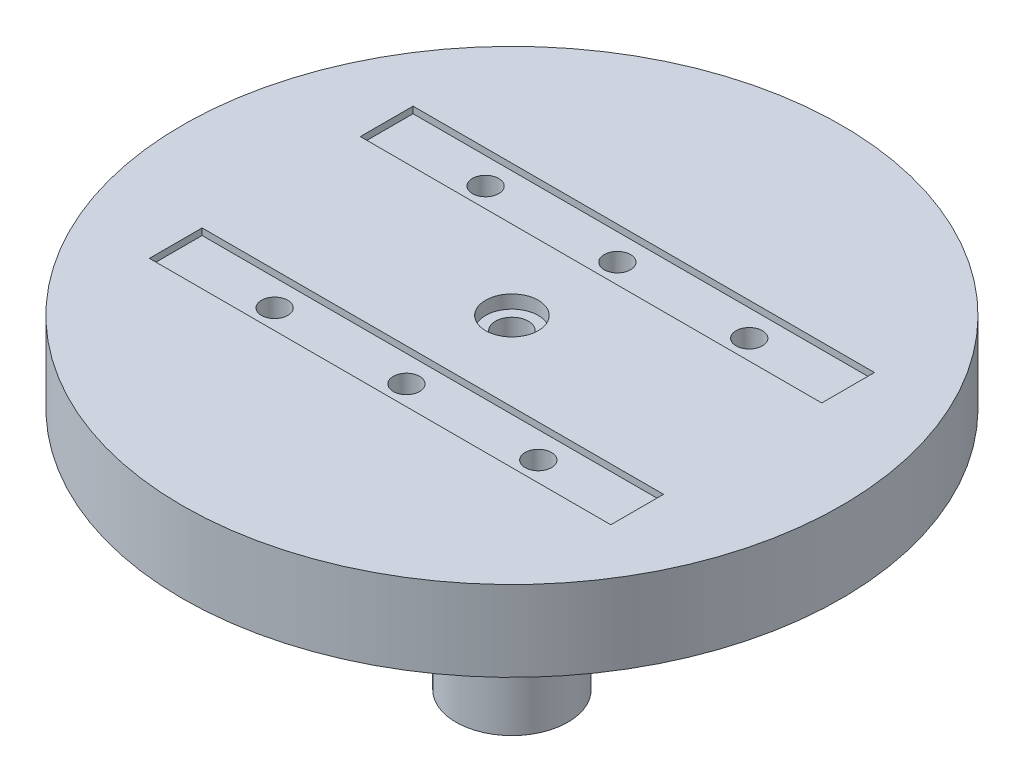
ISO-10303-21;
HEADER;
FILE_DESCRIPTION(('STEP AP214'),'2;1');
FILE_NAME('part.step','',(''),(''),'','','');
FILE_SCHEMA(('AUTOMOTIVE_DESIGN { 1 0 10303 214 1 1 1 1 }'));
ENDSEC;
DATA;
#1=APPLICATION_CONTEXT('core data for automotive mechanical design processes');
#2=APPLICATION_PROTOCOL_DEFINITION('international standard','automotive_design',2000,#1);
#3=PRODUCT_CONTEXT('',#1,'mechanical');
#4=PRODUCT('Part','Part','',(#3));
#5=PRODUCT_RELATED_PRODUCT_CATEGORY('part','',(#4));
#6=PRODUCT_DEFINITION_FORMATION('','',#4);
#7=PRODUCT_DEFINITION_CONTEXT('part definition',#1,'design');
#8=PRODUCT_DEFINITION('design','',#6,#7);
#9=PRODUCT_DEFINITION_SHAPE('','',#8);
#10=(LENGTH_UNIT() NAMED_UNIT(*) SI_UNIT(.MILLI.,.METRE.));
#11=(NAMED_UNIT(*) PLANE_ANGLE_UNIT() SI_UNIT($,.RADIAN.));
#12=(NAMED_UNIT(*) SI_UNIT($,.STERADIAN.) SOLID_ANGLE_UNIT());
#13=UNCERTAINTY_MEASURE_WITH_UNIT(LENGTH_MEASURE(1.E-05),#10,'distance_accuracy_value','');
#14=(GEOMETRIC_REPRESENTATION_CONTEXT(3) GLOBAL_UNCERTAINTY_ASSIGNED_CONTEXT((#13)) GLOBAL_UNIT_ASSIGNED_CONTEXT((#10,
#11,#12)) REPRESENTATION_CONTEXT('',''));
#15=CARTESIAN_POINT('',(0.,0.,0.));
#16=DIRECTION('',(0.,0.,1.));
#17=DIRECTION('',(1.,0.,0.));
#18=AXIS2_PLACEMENT_3D('',#15,#16,#17);
#19=CARTESIAN_POINT('',(0.,-16.,0.));
#20=DIRECTION('',(0.,1.,0.));
#21=DIRECTION('',(0.,0.,1.));
#22=AXIS2_PLACEMENT_3D('',#19,#20,#21);
#23=CYLINDRICAL_SURFACE('',#22,20.);
#24=CARTESIAN_POINT('',(0.,-6.,0.));
#25=DIRECTION('',(0.,-1.,0.));
#26=DIRECTION('',(0.,0.,-1.));
#27=AXIS2_PLACEMENT_3D('',#24,#25,#26);
#28=CIRCLE('',#27,20.);
#29=CARTESIAN_POINT('',(0.,-6.,-20.));
#30=VERTEX_POINT('',#29);
#31=EDGE_CURVE('E59',#30,#30,#28,.T.);
#32=ORIENTED_EDGE('',*,*,#31,.T.);
#33=EDGE_LOOP('',(#32));
#34=FACE_BOUND('',#33,.T.);
#35=CARTESIAN_POINT('',(0.,-14.,0.));
#36=DIRECTION('',(0.,-1.,0.));
#37=DIRECTION('',(0.,0.,-1.));
#38=AXIS2_PLACEMENT_3D('',#35,#36,#37);
#39=CIRCLE('',#38,20.);
#40=CARTESIAN_POINT('',(0.,-14.,-20.));
#41=VERTEX_POINT('',#40);
#42=EDGE_CURVE('E63',#41,#41,#39,.F.);
#43=ORIENTED_EDGE('',*,*,#42,.T.);
#44=EDGE_LOOP('',(#43));
#45=FACE_BOUND('',#44,.T.);
#46=ADVANCED_FACE('F48',(#34,#45),#23,.T.);
#47=CARTESIAN_POINT('',(0.,-16.,0.));
#48=DIRECTION('',(0.,-1.,0.));
#49=DIRECTION('',(0.,0.,-1.));
#50=AXIS2_PLACEMENT_3D('',#47,#48,#49);
#51=PLANE('',#50);
#52=CARTESIAN_POINT('',(0.,-16.,0.));
#53=DIRECTION('',(0.,-1.,0.));
#54=DIRECTION('',(0.,0.,-1.));
#55=AXIS2_PLACEMENT_3D('',#52,#53,#54);
#56=CIRCLE('',#55,18.);
#57=CARTESIAN_POINT('',(0.,-16.,-18.));
#58=VERTEX_POINT('',#57);
#59=EDGE_CURVE('E11',#58,#58,#56,.T.);
#60=ORIENTED_EDGE('',*,*,#59,.T.);
#61=EDGE_LOOP('',(#60));
#62=FACE_BOUND('',#61,.T.);
#63=ADVANCED_FACE('F79',(#62),#51,.T.);
#64=CARTESIAN_POINT('',(0.,-4.,0.));
#65=DIRECTION('',(0.,-1.,0.));
#66=DIRECTION('',(0.,0.,-1.));
#67=AXIS2_PLACEMENT_3D('',#64,#65,#66);
#68=PLANE('',#67);
#69=CARTESIAN_POINT('',(0.,-4.,0.));
#70=DIRECTION('',(0.,-1.,0.));
#71=DIRECTION('',(0.,0.,-1.));
#72=AXIS2_PLACEMENT_3D('',#69,#70,#71);
#73=CIRCLE('',#72,18.);
#74=CARTESIAN_POINT('',(0.,-4.,-18.));
#75=VERTEX_POINT('',#74);
#76=EDGE_CURVE('E55',#75,#75,#73,.F.);
#77=ORIENTED_EDGE('',*,*,#76,.T.);
#78=EDGE_LOOP('',(#77));
#79=FACE_BOUND('',#78,.T.);
#80=ADVANCED_FACE('F76',(#79),#68,.F.);
#81=CARTESIAN_POINT('',(0.,-6.,0.));
#82=DIRECTION('',(0.,-1.,0.));
#83=DIRECTION('',(0.,0.,-1.));
#84=AXIS2_PLACEMENT_3D('',#81,#82,#83);
#85=TOROIDAL_SURFACE('',#84,18.,2.);
#86=ORIENTED_EDGE('',*,*,#76,.F.);
#87=EDGE_LOOP('',(#86));
#88=FACE_BOUND('',#87,.T.);
#89=ORIENTED_EDGE('',*,*,#31,.F.);
#90=EDGE_LOOP('',(#89));
#91=FACE_BOUND('',#90,.T.);
#92=ADVANCED_FACE('F72',(#88,#91),#85,.T.);
#93=CARTESIAN_POINT('',(0.,-14.,0.));
#94=DIRECTION('',(0.,-1.,0.));
#95=DIRECTION('',(0.,0.,-1.));
#96=AXIS2_PLACEMENT_3D('',#93,#94,#95);
#97=TOROIDAL_SURFACE('',#96,18.,2.);
#98=ORIENTED_EDGE('',*,*,#42,.F.);
#99=EDGE_LOOP('',(#98));
#100=FACE_BOUND('',#99,.T.);
#101=ORIENTED_EDGE('',*,*,#59,.F.);
#102=EDGE_LOOP('',(#101));
#103=FACE_BOUND('',#102,.T.);
#104=ADVANCED_FACE('F50',(#100,#103),#97,.T.);
#105=CLOSED_SHELL('',(#46,#63,#80,#92,#104));
#106=MANIFOLD_SOLID_BREP('B2',#105);
#107=CARTESIAN_POINT('',(0.,-4.,0.));
#108=DIRECTION('',(0.,1.,0.));
#109=DIRECTION('',(0.,0.,1.));
#110=AXIS2_PLACEMENT_3D('',#107,#108,#109);
#111=CYLINDRICAL_SURFACE('',#110,10.);
#112=CARTESIAN_POINT('',(0.,-4.,0.));
#113=DIRECTION('',(0.,-1.,0.));
#114=DIRECTION('',(0.,0.,-1.));
#115=AXIS2_PLACEMENT_3D('',#112,#113,#114);
#116=CIRCLE('',#115,10.);
#117=CARTESIAN_POINT('',(0.,-4.,-10.));
#118=VERTEX_POINT('',#117);
#119=EDGE_CURVE('E47',#118,#118,#116,.T.);
#120=ORIENTED_EDGE('',*,*,#119,.F.);
#121=EDGE_LOOP('',(#120));
#122=FACE_BOUND('',#121,.T.);
#123=CARTESIAN_POINT('',(0.,-2.,0.));
#124=DIRECTION('',(0.,-1.,0.));
#125=DIRECTION('',(0.,0.,-1.));
#126=AXIS2_PLACEMENT_3D('',#123,#124,#125);
#127=CIRCLE('',#126,10.);
#128=CARTESIAN_POINT('',(0.,-2.,-10.));
#129=VERTEX_POINT('',#128);
#130=EDGE_CURVE('E130',#129,#129,#127,.T.);
#131=ORIENTED_EDGE('',*,*,#130,.T.);
#132=EDGE_LOOP('',(#131));
#133=FACE_BOUND('',#132,.T.);
#134=ADVANCED_FACE('F127',(#122,#133),#111,.T.);
#135=CARTESIAN_POINT('',(0.,-4.,0.));
#136=DIRECTION('',(0.,-1.,0.));
#137=DIRECTION('',(0.,0.,-1.));
#138=AXIS2_PLACEMENT_3D('',#135,#136,#137);
#139=PLANE('',#138);
#140=ORIENTED_EDGE('',*,*,#119,.T.);
#141=EDGE_LOOP('',(#140));
#142=FACE_BOUND('',#141,.T.);
#143=ADVANCED_FACE('F142',(#142),#139,.T.);
#144=CARTESIAN_POINT('',(0.,-2.,0.));
#145=DIRECTION('',(0.,-1.,0.));
#146=DIRECTION('',(0.,0.,-1.));
#147=AXIS2_PLACEMENT_3D('',#144,#145,#146);
#148=PLANE('',#147);
#149=ORIENTED_EDGE('',*,*,#130,.F.);
#150=EDGE_LOOP('',(#149));
#151=FACE_BOUND('',#150,.T.);
#152=ADVANCED_FACE('F140',(#151),#148,.F.);
#153=CLOSED_SHELL('',(#134,#143,#152));
#154=MANIFOLD_SOLID_BREP('B6',#153);
#155=CARTESIAN_POINT('',(0.,-2.,0.));
#156=DIRECTION('',(0.,1.,0.));
#157=DIRECTION('',(0.,0.,1.));
#158=AXIS2_PLACEMENT_3D('',#155,#156,#157);
#159=CYLINDRICAL_SURFACE('',#158,10.);
#160=CARTESIAN_POINT('',(0.,-2.,0.));
#161=DIRECTION('',(0.,-1.,0.));
#162=DIRECTION('',(0.,0.,-1.));
#163=AXIS2_PLACEMENT_3D('',#160,#161,#162);
#164=CIRCLE('',#163,10.);
#165=CARTESIAN_POINT('',(0.,-2.,-10.));
#166=VERTEX_POINT('',#165);
#167=EDGE_CURVE('E126',#166,#166,#164,.T.);
#168=ORIENTED_EDGE('',*,*,#167,.F.);
#169=EDGE_LOOP('',(#168));
#170=FACE_BOUND('',#169,.T.);
#171=CARTESIAN_POINT('',(0.,0.,0.));
#172=DIRECTION('',(0.,-1.,0.));
#173=DIRECTION('',(0.,0.,-1.));
#174=AXIS2_PLACEMENT_3D('',#171,#172,#173);
#175=CIRCLE('',#174,10.);
#176=CARTESIAN_POINT('',(0.,0.,-10.));
#177=VERTEX_POINT('',#176);
#178=EDGE_CURVE('E179',#177,#177,#175,.T.);
#179=ORIENTED_EDGE('',*,*,#178,.T.);
#180=EDGE_LOOP('',(#179));
#181=FACE_BOUND('',#180,.T.);
#182=ADVANCED_FACE('F176',(#170,#181),#159,.T.);
#183=CARTESIAN_POINT('',(0.,-2.,0.));
#184=DIRECTION('',(0.,-1.,0.));
#185=DIRECTION('',(0.,0.,-1.));
#186=AXIS2_PLACEMENT_3D('',#183,#184,#185);
#187=PLANE('',#186);
#188=ORIENTED_EDGE('',*,*,#167,.T.);
#189=EDGE_LOOP('',(#188));
#190=FACE_BOUND('',#189,.T.);
#191=ADVANCED_FACE('F191',(#190),#187,.T.);
#192=CARTESIAN_POINT('',(0.,0.,0.));
#193=DIRECTION('',(0.,-1.,0.));
#194=DIRECTION('',(0.,0.,-1.));
#195=AXIS2_PLACEMENT_3D('',#192,#193,#194);
#196=PLANE('',#195);
#197=ORIENTED_EDGE('',*,*,#178,.F.);
#198=EDGE_LOOP('',(#197));
#199=FACE_BOUND('',#198,.T.);
#200=ADVANCED_FACE('F189',(#199),#196,.F.);
#201=CLOSED_SHELL('',(#182,#191,#200));
#202=MANIFOLD_SOLID_BREP('B42',#201);
#203=CARTESIAN_POINT('',(0.,-37.,0.));
#204=DIRECTION('',(0.,1.,0.));
#205=DIRECTION('',(0.,0.,1.));
#206=AXIS2_PLACEMENT_3D('',#203,#204,#205);
#207=CYLINDRICAL_SURFACE('',#206,8.5);
#208=CARTESIAN_POINT('',(0.,-37.,0.));
#209=DIRECTION('',(0.,-1.,0.));
#210=DIRECTION('',(0.,0.,-1.));
#211=AXIS2_PLACEMENT_3D('',#208,#209,#210);
#212=CIRCLE('',#211,8.5);
#213=CARTESIAN_POINT('',(0.,-37.,-8.5));
#214=VERTEX_POINT('',#213);
#215=EDGE_CURVE('E232',#214,#214,#212,.T.);
#216=ORIENTED_EDGE('',*,*,#215,.F.);
#217=EDGE_LOOP('',(#216));
#218=FACE_BOUND('',#217,.T.);
#219=CARTESIAN_POINT('',(0.,3.,0.));
#220=DIRECTION('',(0.,-1.,0.));
#221=DIRECTION('',(0.,0.,-1.));
#222=AXIS2_PLACEMENT_3D('',#219,#220,#221);
#223=CIRCLE('',#222,8.5);
#224=CARTESIAN_POINT('',(0.,3.,-8.5));
#225=VERTEX_POINT('',#224);
#226=EDGE_CURVE('E236',#225,#225,#223,.T.);
#227=ORIENTED_EDGE('',*,*,#226,.T.);
#228=EDGE_LOOP('',(#227));
#229=FACE_BOUND('',#228,.T.);
#230=ADVANCED_FACE('F226',(#218,#229),#207,.T.);
#231=CARTESIAN_POINT('',(0.,-37.,0.));
#232=DIRECTION('',(0.,-1.,0.));
#233=DIRECTION('',(0.,0.,-1.));
#234=AXIS2_PLACEMENT_3D('',#231,#232,#233);
#235=PLANE('',#234);
#236=CARTESIAN_POINT('',(0.,-37.,0.));
#237=DIRECTION('',(0.,-1.,0.));
#238=DIRECTION('',(0.,0.,-1.));
#239=AXIS2_PLACEMENT_3D('',#236,#237,#238);
#240=CIRCLE('',#239,2.5);
#241=CARTESIAN_POINT('',(0.,-37.,-2.5));
#242=VERTEX_POINT('',#241);
#243=EDGE_CURVE('E243',#242,#242,#240,.T.);
#244=ORIENTED_EDGE('',*,*,#243,.F.);
#245=EDGE_LOOP('',(#244));
#246=FACE_BOUND('',#245,.T.);
#247=ORIENTED_EDGE('',*,*,#215,.T.);
#248=EDGE_LOOP('',(#247));
#249=FACE_BOUND('',#248,.T.);
#250=ADVANCED_FACE('F266',(#246,#249),#235,.T.);
#251=CARTESIAN_POINT('',(0.,3.,0.));
#252=DIRECTION('',(0.,-1.,0.));
#253=DIRECTION('',(0.,0.,-1.));
#254=AXIS2_PLACEMENT_3D('',#251,#252,#253);
#255=PLANE('',#254);
#256=ORIENTED_EDGE('',*,*,#226,.F.);
#257=EDGE_LOOP('',(#256));
#258=FACE_BOUND('',#257,.T.);
#259=ADVANCED_FACE('F257',(#258),#255,.F.);
#260=CARTESIAN_POINT('',(0.,-41.,0.));
#261=DIRECTION('',(0.,-1.,0.));
#262=DIRECTION('',(0.,0.,-1.));
#263=AXIS2_PLACEMENT_3D('',#260,#261,#262);
#264=PLANE('',#263);
#265=CARTESIAN_POINT('',(0.,-41.,0.));
#266=DIRECTION('',(0.,-1.,0.));
#267=DIRECTION('',(0.,0.,-1.));
#268=AXIS2_PLACEMENT_3D('',#265,#266,#267);
#269=CIRCLE('',#268,2.5);
#270=CARTESIAN_POINT('',(0.,-41.,-2.5));
#271=VERTEX_POINT('',#270);
#272=EDGE_CURVE('E241',#271,#271,#269,.T.);
#273=ORIENTED_EDGE('',*,*,#272,.T.);
#274=EDGE_LOOP('',(#273));
#275=FACE_BOUND('',#274,.T.);
#276=CARTESIAN_POINT('',(0.,-41.,0.));
#277=DIRECTION('',(0.,-1.,0.));
#278=DIRECTION('',(0.,0.,-1.));
#279=AXIS2_PLACEMENT_3D('',#276,#277,#278);
#280=CIRCLE('',#279,2.25);
#281=CARTESIAN_POINT('',(0.,-41.,-2.25));
#282=VERTEX_POINT('',#281);
#283=EDGE_CURVE('E246',#282,#282,#280,.T.);
#284=ORIENTED_EDGE('',*,*,#283,.F.);
#285=EDGE_LOOP('',(#284));
#286=FACE_BOUND('',#285,.T.);
#287=ADVANCED_FACE('F254',(#275,#286),#264,.T.);
#288=CARTESIAN_POINT('',(0.,-41.,0.));
#289=DIRECTION('',(0.,1.,0.));
#290=DIRECTION('',(0.,0.,1.));
#291=AXIS2_PLACEMENT_3D('',#288,#289,#290);
#292=CYLINDRICAL_SURFACE('',#291,2.5);
#293=ORIENTED_EDGE('',*,*,#272,.F.);
#294=EDGE_LOOP('',(#293));
#295=FACE_BOUND('',#294,.T.);
#296=ORIENTED_EDGE('',*,*,#243,.T.);
#297=EDGE_LOOP('',(#296));
#298=FACE_BOUND('',#297,.T.);
#299=ADVANCED_FACE('F256',(#295,#298),#292,.T.);
#300=CARTESIAN_POINT('',(0.,-41.,0.));
#301=DIRECTION('',(0.,1.,0.));
#302=DIRECTION('',(0.,0.,1.));
#303=AXIS2_PLACEMENT_3D('',#300,#301,#302);
#304=CYLINDRICAL_SURFACE('',#303,2.25);
#305=ORIENTED_EDGE('',*,*,#283,.T.);
#306=EDGE_LOOP('',(#305));
#307=FACE_BOUND('',#306,.T.);
#308=CARTESIAN_POINT('',(0.,-37.,0.));
#309=DIRECTION('',(0.,-1.,0.));
#310=DIRECTION('',(0.,0.,-1.));
#311=AXIS2_PLACEMENT_3D('',#308,#309,#310);
#312=CIRCLE('',#311,2.25);
#313=CARTESIAN_POINT('',(0.,-37.,-2.25));
#314=VERTEX_POINT('',#313);
#315=EDGE_CURVE('E175',#314,#314,#312,.F.);
#316=ORIENTED_EDGE('',*,*,#315,.T.);
#317=EDGE_LOOP('',(#316));
#318=FACE_BOUND('',#317,.T.);
#319=ADVANCED_FACE('F252',(#307,#318),#304,.F.);
#320=ORIENTED_EDGE('',*,*,#315,.F.);
#321=EDGE_LOOP('',(#320));
#322=FACE_BOUND('',#321,.T.);
#323=ADVANCED_FACE('F276',(#322),#235,.T.);
#324=CLOSED_SHELL('',(#230,#250,#259,#287,#299,#319,#323));
#325=MANIFOLD_SOLID_BREP('B121',#324);
#326=CARTESIAN_POINT('',(0.,0.,0.));
#327=DIRECTION('',(0.,1.,0.));
#328=DIRECTION('',(0.,0.,1.));
#329=AXIS2_PLACEMENT_3D('',#326,#327,#328);
#330=PLANE('',#329);
#331=CARTESIAN_POINT('',(0.,0.,0.));
#332=DIRECTION('',(0.,-1.,0.));
#333=DIRECTION('',(0.,0.,-1.));
#334=AXIS2_PLACEMENT_3D('',#331,#332,#333);
#335=CIRCLE('',#334,8.5);
#336=CARTESIAN_POINT('',(0.,0.,-8.5));
#337=VERTEX_POINT('',#336);
#338=EDGE_CURVE('E548',#337,#337,#335,.T.);
#339=ORIENTED_EDGE('',*,*,#338,.F.);
#340=EDGE_LOOP('',(#339));
#341=FACE_BOUND('',#340,.T.);
#342=CARTESIAN_POINT('',(-20.,0.,16.));
#343=DIRECTION('',(0.,1.,0.));
#344=DIRECTION('',(0.,0.,1.));
#345=AXIS2_PLACEMENT_3D('',#342,#343,#344);
#346=CIRCLE('',#345,2.);
#347=CARTESIAN_POINT('',(-20.,0.,18.));
#348=VERTEX_POINT('',#347);
#349=EDGE_CURVE('E530',#348,#348,#346,.T.);
#350=ORIENTED_EDGE('',*,*,#349,.T.);
#351=EDGE_LOOP('',(#350));
#352=FACE_BOUND('',#351,.T.);
#353=CARTESIAN_POINT('',(-20.,0.,-16.));
#354=DIRECTION('',(0.,-1.,0.));
#355=DIRECTION('',(0.,0.,-1.));
#356=AXIS2_PLACEMENT_3D('',#353,#354,#355);
#357=CIRCLE('',#356,2.);
#358=CARTESIAN_POINT('',(-20.,0.,-18.));
#359=VERTEX_POINT('',#358);
#360=EDGE_CURVE('E527',#359,#359,#357,.T.);
#361=ORIENTED_EDGE('',*,*,#360,.F.);
#362=EDGE_LOOP('',(#361));
#363=FACE_BOUND('',#362,.T.);
#364=CARTESIAN_POINT('',(20.,0.,-16.));
#365=DIRECTION('',(0.,-1.,0.));
#366=DIRECTION('',(0.,0.,-1.));
#367=AXIS2_PLACEMENT_3D('',#364,#365,#366);
#368=CIRCLE('',#367,2.);
#369=CARTESIAN_POINT('',(20.,0.,-18.));
#370=VERTEX_POINT('',#369);
#371=EDGE_CURVE('E531',#370,#370,#368,.T.);
#372=ORIENTED_EDGE('',*,*,#371,.F.);
#373=EDGE_LOOP('',(#372));
#374=FACE_BOUND('',#373,.T.);
#375=CARTESIAN_POINT('',(0.,0.,0.));
#376=DIRECTION('',(0.,1.,0.));
#377=DIRECTION('',(0.,0.,1.));
#378=AXIS2_PLACEMENT_3D('',#375,#376,#377);
#379=CIRCLE('',#378,50.);
#380=CARTESIAN_POINT('',(0.,0.,50.));
#381=VERTEX_POINT('',#380);
#382=EDGE_CURVE('E336',#381,#381,#379,.T.);
#383=ORIENTED_EDGE('',*,*,#382,.F.);
#384=EDGE_LOOP('',(#383));
#385=FACE_BOUND('',#384,.T.);
#386=CARTESIAN_POINT('',(0.,0.,-16.));
#387=DIRECTION('',(0.,1.,0.));
#388=DIRECTION('',(0.,0.,1.));
#389=AXIS2_PLACEMENT_3D('',#386,#387,#388);
#390=CIRCLE('',#389,2.);
#391=CARTESIAN_POINT('',(0.,0.,-14.));
#392=VERTEX_POINT('',#391);
#393=EDGE_CURVE('E424',#392,#392,#390,.F.);
#394=ORIENTED_EDGE('',*,*,#393,.F.);
#395=EDGE_LOOP('',(#394));
#396=FACE_BOUND('',#395,.T.);
#397=CARTESIAN_POINT('',(20.,0.,16.));
#398=DIRECTION('',(0.,1.,0.));
#399=DIRECTION('',(0.,0.,1.));
#400=AXIS2_PLACEMENT_3D('',#397,#398,#399);
#401=CIRCLE('',#400,2.);
#402=CARTESIAN_POINT('',(20.,0.,18.));
#403=VERTEX_POINT('',#402);
#404=EDGE_CURVE('E539',#403,#403,#401,.T.);
#405=ORIENTED_EDGE('',*,*,#404,.T.);
#406=EDGE_LOOP('',(#405));
#407=FACE_BOUND('',#406,.T.);
#408=CARTESIAN_POINT('',(0.,0.,16.));
#409=DIRECTION('',(0.,1.,0.));
#410=DIRECTION('',(0.,0.,1.));
#411=AXIS2_PLACEMENT_3D('',#408,#409,#410);
#412=CIRCLE('',#411,2.);
#413=CARTESIAN_POINT('',(0.,0.,18.));
#414=VERTEX_POINT('',#413);
#415=EDGE_CURVE('E536',#414,#414,#412,.T.);
#416=ORIENTED_EDGE('',*,*,#415,.T.);
#417=EDGE_LOOP('',(#416));
#418=FACE_BOUND('',#417,.T.);
#419=ADVANCED_FACE('F326',(#341,#352,#363,#374,#385,#396,#407,#418),#330,.F.);
#420=CARTESIAN_POINT('',(0.,12.2,0.));
#421=DIRECTION('',(0.,-1.,0.));
#422=DIRECTION('',(0.,0.,-1.));
#423=AXIS2_PLACEMENT_3D('',#420,#421,#422);
#424=CYLINDRICAL_SURFACE('',#423,50.);
#425=CARTESIAN_POINT('',(0.,12.2,0.));
#426=DIRECTION('',(0.,1.,0.));
#427=DIRECTION('',(0.,0.,1.));
#428=AXIS2_PLACEMENT_3D('',#425,#426,#427);
#429=CIRCLE('',#428,50.);
#430=CARTESIAN_POINT('',(0.,12.2,50.));
#431=VERTEX_POINT('',#430);
#432=EDGE_CURVE('E224',#431,#431,#429,.T.);
#433=ORIENTED_EDGE('',*,*,#432,.F.);
#434=EDGE_LOOP('',(#433));
#435=FACE_BOUND('',#434,.T.);
#436=ORIENTED_EDGE('',*,*,#382,.T.);
#437=EDGE_LOOP('',(#436));
#438=FACE_BOUND('',#437,.T.);
#439=ADVANCED_FACE('F328',(#435,#438),#424,.T.);
#440=CARTESIAN_POINT('',(0.,12.2,0.));
#441=DIRECTION('',(0.,1.,0.));
#442=DIRECTION('',(0.,0.,1.));
#443=AXIS2_PLACEMENT_3D('',#440,#441,#442);
#444=PLANE('',#443);
#445=CARTESIAN_POINT('',(0.,12.2,0.));
#446=DIRECTION('',(0.,1.,0.));
#447=DIRECTION('',(0.,0.,1.));
#448=AXIS2_PLACEMENT_3D('',#445,#446,#447);
#449=CIRCLE('',#448,4.);
#450=CARTESIAN_POINT('',(0.,12.2,4.));
#451=VERTEX_POINT('',#450);
#452=EDGE_CURVE('E556',#451,#451,#449,.T.);
#453=ORIENTED_EDGE('',*,*,#452,.F.);
#454=EDGE_LOOP('',(#453));
#455=FACE_BOUND('',#454,.T.);
#456=DIRECTION('',(0.,0.,-1.));
#457=VECTOR('',#456,1.);
#458=CARTESIAN_POINT('',(35.,12.2,12.));
#459=LINE('',#458,#457);
#460=CARTESIAN_POINT('',(35.,12.2,20.));
#461=VERTEX_POINT('',#460);
#462=CARTESIAN_POINT('',(35.,12.2,12.));
#463=VERTEX_POINT('',#462);
#464=EDGE_CURVE('E344',#461,#463,#459,.T.);
#465=ORIENTED_EDGE('',*,*,#464,.F.);
#466=DIRECTION('',(1.,0.,0.));
#467=VECTOR('',#466,1.);
#468=CARTESIAN_POINT('',(-35.,12.2,20.));
#469=LINE('',#468,#467);
#470=CARTESIAN_POINT('',(-35.,12.2,20.));
#471=VERTEX_POINT('',#470);
#472=EDGE_CURVE('E417',#471,#461,#469,.T.);
#473=ORIENTED_EDGE('',*,*,#472,.F.);
#474=DIRECTION('',(0.,0.,1.));
#475=VECTOR('',#474,1.);
#476=CARTESIAN_POINT('',(-35.,12.2,12.));
#477=LINE('',#476,#475);
#478=CARTESIAN_POINT('',(-35.,12.2,12.));
#479=VERTEX_POINT('',#478);
#480=EDGE_CURVE('E421',#479,#471,#477,.T.);
#481=ORIENTED_EDGE('',*,*,#480,.F.);
#482=DIRECTION('',(-1.,0.,0.));
#483=VECTOR('',#482,1.);
#484=CARTESIAN_POINT('',(-35.,12.2,12.));
#485=LINE('',#484,#483);
#486=EDGE_CURVE('E433',#463,#479,#485,.T.);
#487=ORIENTED_EDGE('',*,*,#486,.F.);
#488=EDGE_LOOP('',(#465,#473,#481,#487));
#489=FACE_BOUND('',#488,.T.);
#490=DIRECTION('',(0.,0.,-1.));
#491=VECTOR('',#490,1.);
#492=CARTESIAN_POINT('',(35.,12.2,-20.));
#493=LINE('',#492,#491);
#494=CARTESIAN_POINT('',(35.,12.2,-12.));
#495=VERTEX_POINT('',#494);
#496=CARTESIAN_POINT('',(35.,12.2,-20.));
#497=VERTEX_POINT('',#496);
#498=EDGE_CURVE('E352',#495,#497,#493,.T.);
#499=ORIENTED_EDGE('',*,*,#498,.F.);
#500=DIRECTION('',(1.,0.,0.));
#501=VECTOR('',#500,1.);
#502=CARTESIAN_POINT('',(-35.,12.2,-12.));
#503=LINE('',#502,#501);
#504=CARTESIAN_POINT('',(-35.,12.2,-12.));
#505=VERTEX_POINT('',#504);
#506=EDGE_CURVE('E453',#505,#495,#503,.T.);
#507=ORIENTED_EDGE('',*,*,#506,.F.);
#508=DIRECTION('',(0.,0.,1.));
#509=VECTOR('',#508,1.);
#510=CARTESIAN_POINT('',(-35.,12.2,-20.));
#511=LINE('',#510,#509);
#512=CARTESIAN_POINT('',(-35.,12.2,-20.));
#513=VERTEX_POINT('',#512);
#514=EDGE_CURVE('E473',#513,#505,#511,.T.);
#515=ORIENTED_EDGE('',*,*,#514,.F.);
#516=DIRECTION('',(-1.,0.,0.));
#517=VECTOR('',#516,1.);
#518=CARTESIAN_POINT('',(-35.,12.2,-20.));
#519=LINE('',#518,#517);
#520=EDGE_CURVE('E468',#497,#513,#519,.T.);
#521=ORIENTED_EDGE('',*,*,#520,.F.);
#522=EDGE_LOOP('',(#499,#507,#515,#521));
#523=FACE_BOUND('',#522,.T.);
#524=ORIENTED_EDGE('',*,*,#432,.T.);
#525=EDGE_LOOP('',(#524));
#526=FACE_BOUND('',#525,.T.);
#527=ADVANCED_FACE('F653',(#455,#489,#523,#526),#444,.T.);
#528=CARTESIAN_POINT('',(35.,11.2,-20.));
#529=DIRECTION('',(1.,0.,0.));
#530=DIRECTION('',(0.,0.,-1.));
#531=AXIS2_PLACEMENT_3D('',#528,#529,#530);
#532=PLANE('',#531);
#533=ORIENTED_EDGE('',*,*,#498,.T.);
#534=DIRECTION('',(0.,1.,0.));
#535=VECTOR('',#534,1.);
#536=CARTESIAN_POINT('',(35.,11.2,-20.));
#537=LINE('',#536,#535);
#538=CARTESIAN_POINT('',(35.,11.2,-20.));
#539=VERTEX_POINT('',#538);
#540=EDGE_CURVE('E465',#539,#497,#537,.T.);
#541=ORIENTED_EDGE('',*,*,#540,.F.);
#542=DIRECTION('',(0.,0.,-1.));
#543=VECTOR('',#542,1.);
#544=CARTESIAN_POINT('',(35.,11.2,-20.));
#545=LINE('',#544,#543);
#546=CARTESIAN_POINT('',(35.,11.2,-12.));
#547=VERTEX_POINT('',#546);
#548=EDGE_CURVE('E448',#547,#539,#545,.T.);
#549=ORIENTED_EDGE('',*,*,#548,.F.);
#550=DIRECTION('',(0.,1.,0.));
#551=VECTOR('',#550,1.);
#552=CARTESIAN_POINT('',(35.,11.2,-12.));
#553=LINE('',#552,#551);
#554=EDGE_CURVE('E434',#547,#495,#553,.T.);
#555=ORIENTED_EDGE('',*,*,#554,.T.);
#556=EDGE_LOOP('',(#533,#541,#549,#555));
#557=FACE_BOUND('',#556,.T.);
#558=ADVANCED_FACE('F643',(#557),#532,.F.);
#559=CARTESIAN_POINT('',(-35.,11.2,-12.));
#560=DIRECTION('',(0.,0.,1.));
#561=DIRECTION('',(1.,0.,0.));
#562=AXIS2_PLACEMENT_3D('',#559,#560,#561);
#563=PLANE('',#562);
#564=ORIENTED_EDGE('',*,*,#506,.T.);
#565=ORIENTED_EDGE('',*,*,#554,.F.);
#566=DIRECTION('',(1.,0.,0.));
#567=VECTOR('',#566,1.);
#568=CARTESIAN_POINT('',(-35.,11.2,-12.));
#569=LINE('',#568,#567);
#570=CARTESIAN_POINT('',(-35.,11.2,-12.));
#571=VERTEX_POINT('',#570);
#572=EDGE_CURVE('E461',#571,#547,#569,.T.);
#573=ORIENTED_EDGE('',*,*,#572,.F.);
#574=DIRECTION('',(0.,1.,0.));
#575=VECTOR('',#574,1.);
#576=CARTESIAN_POINT('',(-35.,11.2,-12.));
#577=LINE('',#576,#575);
#578=EDGE_CURVE('E482',#571,#505,#577,.T.);
#579=ORIENTED_EDGE('',*,*,#578,.T.);
#580=EDGE_LOOP('',(#564,#565,#573,#579));
#581=FACE_BOUND('',#580,.T.);
#582=ADVANCED_FACE('F639',(#581),#563,.F.);
#583=CARTESIAN_POINT('',(-35.,11.2,-20.));
#584=DIRECTION('',(-1.,0.,0.));
#585=DIRECTION('',(0.,0.,1.));
#586=AXIS2_PLACEMENT_3D('',#583,#584,#585);
#587=PLANE('',#586);
#588=ORIENTED_EDGE('',*,*,#514,.T.);
#589=ORIENTED_EDGE('',*,*,#578,.F.);
#590=DIRECTION('',(0.,0.,1.));
#591=VECTOR('',#590,1.);
#592=CARTESIAN_POINT('',(-35.,11.2,-20.));
#593=LINE('',#592,#591);
#594=CARTESIAN_POINT('',(-35.,11.2,-20.));
#595=VERTEX_POINT('',#594);
#596=EDGE_CURVE('E457',#595,#571,#593,.T.);
#597=ORIENTED_EDGE('',*,*,#596,.F.);
#598=DIRECTION('',(0.,1.,0.));
#599=VECTOR('',#598,1.);
#600=CARTESIAN_POINT('',(-35.,11.2,-20.));
#601=LINE('',#600,#599);
#602=EDGE_CURVE('E485',#595,#513,#601,.T.);
#603=ORIENTED_EDGE('',*,*,#602,.T.);
#604=EDGE_LOOP('',(#588,#589,#597,#603));
#605=FACE_BOUND('',#604,.T.);
#606=ADVANCED_FACE('F642',(#605),#587,.F.);
#607=CARTESIAN_POINT('',(-35.,11.2,-20.));
#608=DIRECTION('',(0.,0.,-1.));
#609=DIRECTION('',(-1.,0.,0.));
#610=AXIS2_PLACEMENT_3D('',#607,#608,#609);
#611=PLANE('',#610);
#612=ORIENTED_EDGE('',*,*,#520,.T.);
#613=ORIENTED_EDGE('',*,*,#602,.F.);
#614=DIRECTION('',(-1.,0.,0.));
#615=VECTOR('',#614,1.);
#616=CARTESIAN_POINT('',(-35.,11.2,-20.));
#617=LINE('',#616,#615);
#618=EDGE_CURVE('E452',#539,#595,#617,.T.);
#619=ORIENTED_EDGE('',*,*,#618,.F.);
#620=ORIENTED_EDGE('',*,*,#540,.T.);
#621=EDGE_LOOP('',(#612,#613,#619,#620));
#622=FACE_BOUND('',#621,.T.);
#623=ADVANCED_FACE('F638',(#622),#611,.F.);
#624=CARTESIAN_POINT('',(0.,11.2,0.));
#625=DIRECTION('',(0.,1.,0.));
#626=DIRECTION('',(0.,0.,1.));
#627=AXIS2_PLACEMENT_3D('',#624,#625,#626);
#628=PLANE('',#627);
#629=CARTESIAN_POINT('',(-20.,11.2,-16.));
#630=DIRECTION('',(0.,1.,0.));
#631=DIRECTION('',(0.,0.,1.));
#632=AXIS2_PLACEMENT_3D('',#629,#630,#631);
#633=CIRCLE('',#632,2.);
#634=CARTESIAN_POINT('',(-20.,11.2,-14.));
#635=VERTEX_POINT('',#634);
#636=EDGE_CURVE('E469',#635,#635,#633,.F.);
#637=ORIENTED_EDGE('',*,*,#636,.T.);
#638=EDGE_LOOP('',(#637));
#639=FACE_BOUND('',#638,.T.);
#640=CARTESIAN_POINT('',(20.,11.2,-16.));
#641=DIRECTION('',(0.,1.,0.));
#642=DIRECTION('',(0.,0.,1.));
#643=AXIS2_PLACEMENT_3D('',#640,#641,#642);
#644=CIRCLE('',#643,2.);
#645=CARTESIAN_POINT('',(20.,11.2,-14.));
#646=VERTEX_POINT('',#645);
#647=EDGE_CURVE('E509',#646,#646,#644,.F.);
#648=ORIENTED_EDGE('',*,*,#647,.T.);
#649=EDGE_LOOP('',(#648));
#650=FACE_BOUND('',#649,.T.);
#651=CARTESIAN_POINT('',(0.,11.2,-16.));
#652=DIRECTION('',(0.,1.,0.));
#653=DIRECTION('',(0.,0.,1.));
#654=AXIS2_PLACEMENT_3D('',#651,#652,#653);
#655=CIRCLE('',#654,2.);
#656=CARTESIAN_POINT('',(0.,11.2,-14.));
#657=VERTEX_POINT('',#656);
#658=EDGE_CURVE('E505',#657,#657,#655,.F.);
#659=ORIENTED_EDGE('',*,*,#658,.T.);
#660=EDGE_LOOP('',(#659));
#661=FACE_BOUND('',#660,.T.);
#662=ORIENTED_EDGE('',*,*,#548,.T.);
#663=ORIENTED_EDGE('',*,*,#618,.T.);
#664=ORIENTED_EDGE('',*,*,#596,.T.);
#665=ORIENTED_EDGE('',*,*,#572,.T.);
#666=EDGE_LOOP('',(#662,#663,#664,#665));
#667=FACE_BOUND('',#666,.T.);
#668=ADVANCED_FACE('F516',(#639,#650,#661,#667),#628,.T.);
#669=CARTESIAN_POINT('',(35.,11.2,12.));
#670=DIRECTION('',(1.,0.,0.));
#671=DIRECTION('',(0.,0.,-1.));
#672=AXIS2_PLACEMENT_3D('',#669,#670,#671);
#673=PLANE('',#672);
#674=ORIENTED_EDGE('',*,*,#464,.T.);
#675=DIRECTION('',(0.,1.,0.));
#676=VECTOR('',#675,1.);
#677=CARTESIAN_POINT('',(35.,11.2,12.));
#678=LINE('',#677,#676);
#679=CARTESIAN_POINT('',(35.,11.2,12.));
#680=VERTEX_POINT('',#679);
#681=EDGE_CURVE('E392',#680,#463,#678,.T.);
#682=ORIENTED_EDGE('',*,*,#681,.F.);
#683=DIRECTION('',(0.,0.,-1.));
#684=VECTOR('',#683,1.);
#685=CARTESIAN_POINT('',(35.,11.2,12.));
#686=LINE('',#685,#684);
#687=CARTESIAN_POINT('',(35.,11.2,20.));
#688=VERTEX_POINT('',#687);
#689=EDGE_CURVE('E396',#688,#680,#686,.T.);
#690=ORIENTED_EDGE('',*,*,#689,.F.);
#691=DIRECTION('',(0.,1.,0.));
#692=VECTOR('',#691,1.);
#693=CARTESIAN_POINT('',(35.,11.2,20.));
#694=LINE('',#693,#692);
#695=EDGE_CURVE('E440',#688,#461,#694,.T.);
#696=ORIENTED_EDGE('',*,*,#695,.T.);
#697=EDGE_LOOP('',(#674,#682,#690,#696));
#698=FACE_BOUND('',#697,.T.);
#699=ADVANCED_FACE('F394',(#698),#673,.F.);
#700=CARTESIAN_POINT('',(-35.,11.2,20.));
#701=DIRECTION('',(0.,0.,1.));
#702=DIRECTION('',(1.,0.,0.));
#703=AXIS2_PLACEMENT_3D('',#700,#701,#702);
#704=PLANE('',#703);
#705=ORIENTED_EDGE('',*,*,#472,.T.);
#706=ORIENTED_EDGE('',*,*,#695,.F.);
#707=DIRECTION('',(1.,0.,0.));
#708=VECTOR('',#707,1.);
#709=CARTESIAN_POINT('',(-35.,11.2,20.));
#710=LINE('',#709,#708);
#711=CARTESIAN_POINT('',(-35.,11.2,20.));
#712=VERTEX_POINT('',#711);
#713=EDGE_CURVE('E403',#712,#688,#710,.T.);
#714=ORIENTED_EDGE('',*,*,#713,.F.);
#715=DIRECTION('',(0.,1.,0.));
#716=VECTOR('',#715,1.);
#717=CARTESIAN_POINT('',(-35.,11.2,20.));
#718=LINE('',#717,#716);
#719=EDGE_CURVE('E443',#712,#471,#718,.T.);
#720=ORIENTED_EDGE('',*,*,#719,.T.);
#721=EDGE_LOOP('',(#705,#706,#714,#720));
#722=FACE_BOUND('',#721,.T.);
#723=ADVANCED_FACE('F624',(#722),#704,.F.);
#724=CARTESIAN_POINT('',(-35.,11.2,12.));
#725=DIRECTION('',(-1.,0.,0.));
#726=DIRECTION('',(0.,0.,1.));
#727=AXIS2_PLACEMENT_3D('',#724,#725,#726);
#728=PLANE('',#727);
#729=ORIENTED_EDGE('',*,*,#480,.T.);
#730=ORIENTED_EDGE('',*,*,#719,.F.);
#731=DIRECTION('',(0.,0.,1.));
#732=VECTOR('',#731,1.);
#733=CARTESIAN_POINT('',(-35.,11.2,12.));
#734=LINE('',#733,#732);
#735=CARTESIAN_POINT('',(-35.,11.2,12.));
#736=VERTEX_POINT('',#735);
#737=EDGE_CURVE('E412',#736,#712,#734,.T.);
#738=ORIENTED_EDGE('',*,*,#737,.F.);
#739=DIRECTION('',(0.,1.,0.));
#740=VECTOR('',#739,1.);
#741=CARTESIAN_POINT('',(-35.,11.2,12.));
#742=LINE('',#741,#740);
#743=EDGE_CURVE('E402',#736,#479,#742,.T.);
#744=ORIENTED_EDGE('',*,*,#743,.T.);
#745=EDGE_LOOP('',(#729,#730,#738,#744));
#746=FACE_BOUND('',#745,.T.);
#747=ADVANCED_FACE('F627',(#746),#728,.F.);
#748=CARTESIAN_POINT('',(-35.,11.2,12.));
#749=DIRECTION('',(0.,0.,-1.));
#750=DIRECTION('',(-1.,0.,0.));
#751=AXIS2_PLACEMENT_3D('',#748,#749,#750);
#752=PLANE('',#751);
#753=ORIENTED_EDGE('',*,*,#486,.T.);
#754=ORIENTED_EDGE('',*,*,#743,.F.);
#755=DIRECTION('',(-1.,0.,0.));
#756=VECTOR('',#755,1.);
#757=CARTESIAN_POINT('',(-35.,11.2,12.));
#758=LINE('',#757,#756);
#759=EDGE_CURVE('E406',#680,#736,#758,.T.);
#760=ORIENTED_EDGE('',*,*,#759,.F.);
#761=ORIENTED_EDGE('',*,*,#681,.T.);
#762=EDGE_LOOP('',(#753,#754,#760,#761));
#763=FACE_BOUND('',#762,.T.);
#764=ADVANCED_FACE('F407',(#763),#752,.F.);
#765=CARTESIAN_POINT('',(0.,11.2,0.));
#766=DIRECTION('',(0.,1.,0.));
#767=DIRECTION('',(0.,0.,1.));
#768=AXIS2_PLACEMENT_3D('',#765,#766,#767);
#769=PLANE('',#768);
#770=CARTESIAN_POINT('',(0.,11.2,16.));
#771=DIRECTION('',(0.,1.,0.));
#772=DIRECTION('',(0.,0.,1.));
#773=AXIS2_PLACEMENT_3D('',#770,#771,#772);
#774=CIRCLE('',#773,2.);
#775=CARTESIAN_POINT('',(0.,11.2,18.));
#776=VERTEX_POINT('',#775);
#777=EDGE_CURVE('E501',#776,#776,#774,.T.);
#778=ORIENTED_EDGE('',*,*,#777,.F.);
#779=EDGE_LOOP('',(#778));
#780=FACE_BOUND('',#779,.T.);
#781=CARTESIAN_POINT('',(-20.,11.2,16.));
#782=DIRECTION('',(0.,1.,0.));
#783=DIRECTION('',(0.,0.,1.));
#784=AXIS2_PLACEMENT_3D('',#781,#782,#783);
#785=CIRCLE('',#784,2.);
#786=CARTESIAN_POINT('',(-20.,11.2,18.));
#787=VERTEX_POINT('',#786);
#788=EDGE_CURVE('E497',#787,#787,#785,.T.);
#789=ORIENTED_EDGE('',*,*,#788,.F.);
#790=EDGE_LOOP('',(#789));
#791=FACE_BOUND('',#790,.T.);
#792=CARTESIAN_POINT('',(20.,11.2,16.));
#793=DIRECTION('',(0.,1.,0.));
#794=DIRECTION('',(0.,0.,1.));
#795=AXIS2_PLACEMENT_3D('',#792,#793,#794);
#796=CIRCLE('',#795,2.);
#797=CARTESIAN_POINT('',(20.,11.2,18.));
#798=VERTEX_POINT('',#797);
#799=EDGE_CURVE('E493',#798,#798,#796,.T.);
#800=ORIENTED_EDGE('',*,*,#799,.F.);
#801=EDGE_LOOP('',(#800));
#802=FACE_BOUND('',#801,.T.);
#803=ORIENTED_EDGE('',*,*,#689,.T.);
#804=ORIENTED_EDGE('',*,*,#759,.T.);
#805=ORIENTED_EDGE('',*,*,#737,.T.);
#806=ORIENTED_EDGE('',*,*,#713,.T.);
#807=EDGE_LOOP('',(#803,#804,#805,#806));
#808=FACE_BOUND('',#807,.T.);
#809=ADVANCED_FACE('F414',(#780,#791,#802,#808),#769,.T.);
#810=CARTESIAN_POINT('',(20.,0.,16.));
#811=DIRECTION('',(0.,1.,0.));
#812=DIRECTION('',(0.,0.,1.));
#813=AXIS2_PLACEMENT_3D('',#810,#811,#812);
#814=CYLINDRICAL_SURFACE('',#813,2.);
#815=ORIENTED_EDGE('',*,*,#799,.T.);
#816=EDGE_LOOP('',(#815));
#817=FACE_BOUND('',#816,.T.);
#818=ORIENTED_EDGE('',*,*,#404,.F.);
#819=EDGE_LOOP('',(#818));
#820=FACE_BOUND('',#819,.T.);
#821=ADVANCED_FACE('F613',(#817,#820),#814,.F.);
#822=CARTESIAN_POINT('',(-20.,0.,16.));
#823=DIRECTION('',(0.,1.,0.));
#824=DIRECTION('',(0.,0.,1.));
#825=AXIS2_PLACEMENT_3D('',#822,#823,#824);
#826=CYLINDRICAL_SURFACE('',#825,2.);
#827=ORIENTED_EDGE('',*,*,#788,.T.);
#828=EDGE_LOOP('',(#827));
#829=FACE_BOUND('',#828,.T.);
#830=ORIENTED_EDGE('',*,*,#349,.F.);
#831=EDGE_LOOP('',(#830));
#832=FACE_BOUND('',#831,.T.);
#833=ADVANCED_FACE('F604',(#829,#832),#826,.F.);
#834=CARTESIAN_POINT('',(0.,0.,16.));
#835=DIRECTION('',(0.,1.,0.));
#836=DIRECTION('',(0.,0.,1.));
#837=AXIS2_PLACEMENT_3D('',#834,#835,#836);
#838=CYLINDRICAL_SURFACE('',#837,2.);
#839=ORIENTED_EDGE('',*,*,#777,.T.);
#840=EDGE_LOOP('',(#839));
#841=FACE_BOUND('',#840,.T.);
#842=ORIENTED_EDGE('',*,*,#415,.F.);
#843=EDGE_LOOP('',(#842));
#844=FACE_BOUND('',#843,.T.);
#845=ADVANCED_FACE('F601',(#841,#844),#838,.F.);
#846=CARTESIAN_POINT('',(0.,0.,-16.));
#847=DIRECTION('',(0.,1.,0.));
#848=DIRECTION('',(0.,0.,1.));
#849=AXIS2_PLACEMENT_3D('',#846,#847,#848);
#850=CYLINDRICAL_SURFACE('',#849,2.);
#851=ORIENTED_EDGE('',*,*,#658,.F.);
#852=EDGE_LOOP('',(#851));
#853=FACE_BOUND('',#852,.T.);
#854=ORIENTED_EDGE('',*,*,#393,.T.);
#855=EDGE_LOOP('',(#854));
#856=FACE_BOUND('',#855,.T.);
#857=ADVANCED_FACE('F603',(#853,#856),#850,.F.);
#858=CARTESIAN_POINT('',(20.,0.,-16.));
#859=DIRECTION('',(0.,1.,0.));
#860=DIRECTION('',(0.,0.,1.));
#861=AXIS2_PLACEMENT_3D('',#858,#859,#860);
#862=CYLINDRICAL_SURFACE('',#861,2.);
#863=ORIENTED_EDGE('',*,*,#647,.F.);
#864=EDGE_LOOP('',(#863));
#865=FACE_BOUND('',#864,.T.);
#866=ORIENTED_EDGE('',*,*,#371,.T.);
#867=EDGE_LOOP('',(#866));
#868=FACE_BOUND('',#867,.T.);
#869=ADVANCED_FACE('F523',(#865,#868),#862,.F.);
#870=CARTESIAN_POINT('',(-20.,0.,-16.));
#871=DIRECTION('',(0.,1.,0.));
#872=DIRECTION('',(0.,0.,1.));
#873=AXIS2_PLACEMENT_3D('',#870,#871,#872);
#874=CYLINDRICAL_SURFACE('',#873,2.);
#875=ORIENTED_EDGE('',*,*,#636,.F.);
#876=EDGE_LOOP('',(#875));
#877=FACE_BOUND('',#876,.T.);
#878=ORIENTED_EDGE('',*,*,#360,.T.);
#879=EDGE_LOOP('',(#878));
#880=FACE_BOUND('',#879,.T.);
#881=ADVANCED_FACE('F519',(#877,#880),#874,.F.);
#882=CARTESIAN_POINT('',(0.,3.,0.));
#883=DIRECTION('',(0.,-1.,0.));
#884=DIRECTION('',(0.,0.,-1.));
#885=AXIS2_PLACEMENT_3D('',#882,#883,#884);
#886=CYLINDRICAL_SURFACE('',#885,8.5);
#887=CARTESIAN_POINT('',(0.,3.,0.));
#888=DIRECTION('',(0.,-1.,0.));
#889=DIRECTION('',(0.,0.,-1.));
#890=AXIS2_PLACEMENT_3D('',#887,#888,#889);
#891=CIRCLE('',#890,8.5);
#892=CARTESIAN_POINT('',(0.,3.,-8.5));
#893=VERTEX_POINT('',#892);
#894=EDGE_CURVE('E547',#893,#893,#891,.T.);
#895=ORIENTED_EDGE('',*,*,#894,.F.);
#896=EDGE_LOOP('',(#895));
#897=FACE_BOUND('',#896,.T.);
#898=ORIENTED_EDGE('',*,*,#338,.T.);
#899=EDGE_LOOP('',(#898));
#900=FACE_BOUND('',#899,.T.);
#901=ADVANCED_FACE('F522',(#897,#900),#886,.F.);
#902=CARTESIAN_POINT('',(0.,3.,0.));
#903=DIRECTION('',(0.,-1.,0.));
#904=DIRECTION('',(0.,0.,-1.));
#905=AXIS2_PLACEMENT_3D('',#902,#903,#904);
#906=PLANE('',#905);
#907=CARTESIAN_POINT('',(0.,3.,0.));
#908=DIRECTION('',(0.,-1.,0.));
#909=DIRECTION('',(0.,0.,-1.));
#910=AXIS2_PLACEMENT_3D('',#907,#908,#909);
#911=CIRCLE('',#910,2.5);
#912=CARTESIAN_POINT('',(0.,3.,-2.5));
#913=VERTEX_POINT('',#912);
#914=EDGE_CURVE('E330',#913,#913,#911,.T.);
#915=ORIENTED_EDGE('',*,*,#914,.F.);
#916=EDGE_LOOP('',(#915));
#917=FACE_BOUND('',#916,.T.);
#918=ORIENTED_EDGE('',*,*,#894,.T.);
#919=EDGE_LOOP('',(#918));
#920=FACE_BOUND('',#919,.T.);
#921=ADVANCED_FACE('F574',(#917,#920),#906,.T.);
#922=CARTESIAN_POINT('',(0.,10.2,0.));
#923=DIRECTION('',(0.,1.,0.));
#924=DIRECTION('',(0.,0.,1.));
#925=AXIS2_PLACEMENT_3D('',#922,#923,#924);
#926=CYLINDRICAL_SURFACE('',#925,4.);
#927=CARTESIAN_POINT('',(0.,10.2,0.));
#928=DIRECTION('',(0.,1.,0.));
#929=DIRECTION('',(0.,0.,1.));
#930=AXIS2_PLACEMENT_3D('',#927,#928,#929);
#931=CIRCLE('',#930,4.);
#932=CARTESIAN_POINT('',(0.,10.2,4.));
#933=VERTEX_POINT('',#932);
#934=EDGE_CURVE('E552',#933,#933,#931,.T.);
#935=ORIENTED_EDGE('',*,*,#934,.F.);
#936=EDGE_LOOP('',(#935));
#937=FACE_BOUND('',#936,.T.);
#938=ORIENTED_EDGE('',*,*,#452,.T.);
#939=EDGE_LOOP('',(#938));
#940=FACE_BOUND('',#939,.T.);
#941=ADVANCED_FACE('F577',(#937,#940),#926,.F.);
#942=CARTESIAN_POINT('',(0.,10.2,0.));
#943=DIRECTION('',(0.,1.,0.));
#944=DIRECTION('',(0.,0.,1.));
#945=AXIS2_PLACEMENT_3D('',#942,#943,#944);
#946=PLANE('',#945);
#947=CARTESIAN_POINT('',(0.,10.2,0.));
#948=DIRECTION('',(0.,1.,0.));
#949=DIRECTION('',(0.,0.,1.));
#950=AXIS2_PLACEMENT_3D('',#947,#948,#949);
#951=CIRCLE('',#950,2.5);
#952=CARTESIAN_POINT('',(0.,10.2,2.5));
#953=VERTEX_POINT('',#952);
#954=EDGE_CURVE('E563',#953,#953,#951,.T.);
#955=ORIENTED_EDGE('',*,*,#954,.F.);
#956=EDGE_LOOP('',(#955));
#957=FACE_BOUND('',#956,.T.);
#958=ORIENTED_EDGE('',*,*,#934,.T.);
#959=EDGE_LOOP('',(#958));
#960=FACE_BOUND('',#959,.T.);
#961=ADVANCED_FACE('F678',(#957,#960),#946,.T.);
#962=CARTESIAN_POINT('',(0.,0.,0.));
#963=DIRECTION('',(0.,1.,0.));
#964=DIRECTION('',(0.,0.,1.));
#965=AXIS2_PLACEMENT_3D('',#962,#963,#964);
#966=CYLINDRICAL_SURFACE('',#965,2.5);
#967=ORIENTED_EDGE('',*,*,#914,.T.);
#968=EDGE_LOOP('',(#967));
#969=FACE_BOUND('',#968,.T.);
#970=ORIENTED_EDGE('',*,*,#954,.T.);
#971=EDGE_LOOP('',(#970));
#972=FACE_BOUND('',#971,.T.);
#973=ADVANCED_FACE('F572',(#969,#972),#966,.F.);
#974=CLOSED_SHELL('',(#419,#439,#527,#558,#582,#606,#623,#668,#699,#723,#747,#764,#809,#821,
#833,#845,#857,#869,#881,#901,#921,#941,#961,#973));
#975=MANIFOLD_SOLID_BREP('B170',#974);
#976=ADVANCED_BREP_SHAPE_REPRESENTATION('',(#18,#106,#154,#202,#325,#975),#14);
#977=SHAPE_DEFINITION_REPRESENTATION(#9,#976);
ENDSEC;
END-ISO-10303-21;
